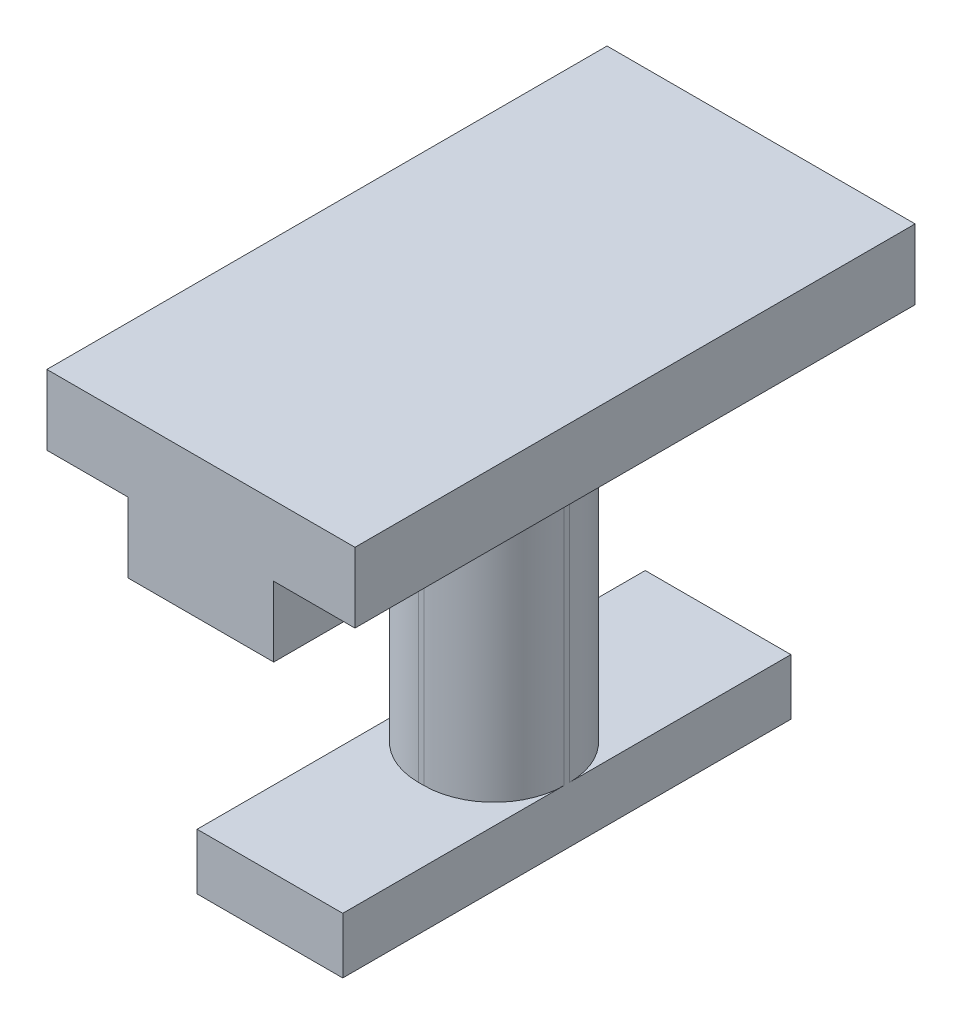
ISO-10303-21;
HEADER;
FILE_DESCRIPTION(('STEP AP214'),'2;1');
FILE_NAME('part.step','',(''),(''),'','','');
FILE_SCHEMA(('AUTOMOTIVE_DESIGN { 1 0 10303 214 1 1 1 1 }'));
ENDSEC;
DATA;
#1=APPLICATION_CONTEXT('core data for automotive mechanical design processes');
#2=APPLICATION_PROTOCOL_DEFINITION('international standard','automotive_design',2000,#1);
#3=PRODUCT_CONTEXT('',#1,'mechanical');
#4=PRODUCT('Part','Part','',(#3));
#5=PRODUCT_RELATED_PRODUCT_CATEGORY('part','',(#4));
#6=PRODUCT_DEFINITION_FORMATION('','',#4);
#7=PRODUCT_DEFINITION_CONTEXT('part definition',#1,'design');
#8=PRODUCT_DEFINITION('design','',#6,#7);
#9=PRODUCT_DEFINITION_SHAPE('','',#8);
#10=(LENGTH_UNIT() NAMED_UNIT(*) SI_UNIT(.MILLI.,.METRE.));
#11=(NAMED_UNIT(*) PLANE_ANGLE_UNIT() SI_UNIT($,.RADIAN.));
#12=(NAMED_UNIT(*) SI_UNIT($,.STERADIAN.) SOLID_ANGLE_UNIT());
#13=UNCERTAINTY_MEASURE_WITH_UNIT(LENGTH_MEASURE(1.E-05),#10,'distance_accuracy_value','');
#14=(GEOMETRIC_REPRESENTATION_CONTEXT(3) GLOBAL_UNCERTAINTY_ASSIGNED_CONTEXT((#13)) GLOBAL_UNIT_ASSIGNED_CONTEXT((#10,
#11,#12)) REPRESENTATION_CONTEXT('',''));
#15=CARTESIAN_POINT('',(0.,0.,0.));
#16=DIRECTION('',(0.,0.,1.));
#17=DIRECTION('',(1.,0.,0.));
#18=AXIS2_PLACEMENT_3D('',#15,#16,#17);
#19=CARTESIAN_POINT('',(2.6,-5.,20.));
#20=DIRECTION('',(0.,1.,0.));
#21=DIRECTION('',(-1.,0.,0.));
#22=AXIS2_PLACEMENT_3D('',#19,#20,#21);
#23=PLANE('',#22);
#24=DIRECTION('',(-1.,0.,0.));
#25=VECTOR('',#24,1.);
#26=CARTESIAN_POINT('',(-2.6,-5.,12.1359307784099));
#27=LINE('',#26,#25);
#28=CARTESIAN_POINT('',(0.0999999999999981,-5.,12.1359307784099));
#29=VERTEX_POINT('',#28);
#30=CARTESIAN_POINT('',(-0.0999999999999981,-5.,12.1359307784099));
#31=VERTEX_POINT('',#30);
#32=EDGE_CURVE('E216',#29,#31,#27,.T.);
#33=ORIENTED_EDGE('',*,*,#32,.F.);
#34=CARTESIAN_POINT('',(0.0999999999999981,-5.,9.63593077840994));
#35=DIRECTION('',(0.,1.,0.));
#36=DIRECTION('',(-1.,0.,0.));
#37=AXIS2_PLACEMENT_3D('',#34,#35,#36);
#38=CIRCLE('',#37,2.5);
#39=CARTESIAN_POINT('',(2.6,-5.,9.63593077840994));
#40=VERTEX_POINT('',#39);
#41=EDGE_CURVE('E359',#29,#40,#38,.T.);
#42=ORIENTED_EDGE('',*,*,#41,.T.);
#43=DIRECTION('',(0.,0.,-1.));
#44=VECTOR('',#43,1.);
#45=CARTESIAN_POINT('',(2.6,-5.,20.));
#46=LINE('',#45,#44);
#47=CARTESIAN_POINT('',(2.6,-5.,20.));
#48=VERTEX_POINT('',#47);
#49=EDGE_CURVE('E61',#48,#40,#46,.T.);
#50=ORIENTED_EDGE('',*,*,#49,.F.);
#51=DIRECTION('',(1.,0.,0.));
#52=VECTOR('',#51,1.);
#53=CARTESIAN_POINT('',(2.6,-5.,20.));
#54=LINE('',#53,#52);
#55=CARTESIAN_POINT('',(-2.6,-5.,20.));
#56=VERTEX_POINT('',#55);
#57=EDGE_CURVE('E251',#56,#48,#54,.T.);
#58=ORIENTED_EDGE('',*,*,#57,.F.);
#59=DIRECTION('',(0.,0.,-1.));
#60=VECTOR('',#59,1.);
#61=CARTESIAN_POINT('',(-2.6,-5.,20.));
#62=LINE('',#61,#60);
#63=CARTESIAN_POINT('',(-2.6,-5.,9.63593077840994));
#64=VERTEX_POINT('',#63);
#65=EDGE_CURVE('E297',#56,#64,#62,.T.);
#66=ORIENTED_EDGE('',*,*,#65,.T.);
#67=CARTESIAN_POINT('',(-0.0999999999999981,-5.,9.63593077840994));
#68=DIRECTION('',(0.,1.,0.));
#69=DIRECTION('',(-1.,0.,0.));
#70=AXIS2_PLACEMENT_3D('',#67,#68,#69);
#71=CIRCLE('',#70,2.5);
#72=EDGE_CURVE('E345',#64,#31,#71,.T.);
#73=ORIENTED_EDGE('',*,*,#72,.T.);
#74=EDGE_LOOP('',(#33,#42,#50,#58,#66,#73));
#75=FACE_BOUND('',#74,.T.);
#76=ADVANCED_FACE('F45',(#75),#23,.F.);
#77=DIRECTION('',(1.,0.,0.));
#78=VECTOR('',#77,1.);
#79=CARTESIAN_POINT('',(-2.6,-5.,6.93593077840994));
#80=LINE('',#79,#78);
#81=CARTESIAN_POINT('',(-0.0999999999999981,-5.,6.93593077840994));
#82=VERTEX_POINT('',#81);
#83=CARTESIAN_POINT('',(0.0999999999999981,-5.,6.93593077840994));
#84=VERTEX_POINT('',#83);
#85=EDGE_CURVE('E211',#82,#84,#80,.T.);
#86=ORIENTED_EDGE('',*,*,#85,.F.);
#87=CARTESIAN_POINT('',(-0.0999999999999981,-5.,9.43593077840995));
#88=DIRECTION('',(0.,1.,0.));
#89=DIRECTION('',(-1.,0.,0.));
#90=AXIS2_PLACEMENT_3D('',#87,#88,#89);
#91=CIRCLE('',#90,2.5);
#92=CARTESIAN_POINT('',(-2.6,-5.,9.43593077840995));
#93=VERTEX_POINT('',#92);
#94=EDGE_CURVE('E352',#82,#93,#91,.T.);
#95=ORIENTED_EDGE('',*,*,#94,.T.);
#96=CARTESIAN_POINT('',(-2.6,-5.,0.));
#97=VERTEX_POINT('',#96);
#98=EDGE_CURVE('E296',#93,#97,#62,.T.);
#99=ORIENTED_EDGE('',*,*,#98,.T.);
#100=DIRECTION('',(1.,0.,0.));
#101=VECTOR('',#100,1.);
#102=CARTESIAN_POINT('',(2.6,-5.,0.));
#103=LINE('',#102,#101);
#104=CARTESIAN_POINT('',(2.6,-5.,0.));
#105=VERTEX_POINT('',#104);
#106=EDGE_CURVE('E277',#97,#105,#103,.T.);
#107=ORIENTED_EDGE('',*,*,#106,.T.);
#108=CARTESIAN_POINT('',(2.6,-5.,9.43593077840995));
#109=VERTEX_POINT('',#108);
#110=EDGE_CURVE('E293',#109,#105,#46,.T.);
#111=ORIENTED_EDGE('',*,*,#110,.F.);
#112=CARTESIAN_POINT('',(0.0999999999999981,-5.,9.43593077840995));
#113=DIRECTION('',(0.,1.,0.));
#114=DIRECTION('',(-1.,0.,0.));
#115=AXIS2_PLACEMENT_3D('',#112,#113,#114);
#116=CIRCLE('',#115,2.5);
#117=EDGE_CURVE('E54',#109,#84,#116,.T.);
#118=ORIENTED_EDGE('',*,*,#117,.T.);
#119=EDGE_LOOP('',(#86,#95,#99,#107,#111,#118));
#120=FACE_BOUND('',#119,.T.);
#121=ADVANCED_FACE('F368',(#120),#23,.F.);
#122=CARTESIAN_POINT('',(5.5,0.,20.));
#123=DIRECTION('',(-1.,0.,0.));
#124=DIRECTION('',(0.,0.,1.));
#125=AXIS2_PLACEMENT_3D('',#122,#123,#124);
#126=PLANE('',#125);
#127=DIRECTION('',(0.,1.,0.));
#128=VECTOR('',#127,1.);
#129=CARTESIAN_POINT('',(5.5,0.,0.));
#130=LINE('',#129,#128);
#131=CARTESIAN_POINT('',(5.5,-2.5,0.));
#132=VERTEX_POINT('',#131);
#133=CARTESIAN_POINT('',(5.5,0.,0.));
#134=VERTEX_POINT('',#133);
#135=EDGE_CURVE('E229',#132,#134,#130,.T.);
#136=ORIENTED_EDGE('',*,*,#135,.T.);
#137=DIRECTION('',(0.,0.,-1.));
#138=VECTOR('',#137,1.);
#139=CARTESIAN_POINT('',(5.5,0.,20.));
#140=LINE('',#139,#138);
#141=CARTESIAN_POINT('',(5.5,0.,20.));
#142=VERTEX_POINT('',#141);
#143=EDGE_CURVE('E312',#142,#134,#140,.T.);
#144=ORIENTED_EDGE('',*,*,#143,.F.);
#145=DIRECTION('',(0.,1.,0.));
#146=VECTOR('',#145,1.);
#147=CARTESIAN_POINT('',(5.5,0.,20.));
#148=LINE('',#147,#146);
#149=CARTESIAN_POINT('',(5.5,-2.5,20.));
#150=VERTEX_POINT('',#149);
#151=EDGE_CURVE('E234',#150,#142,#148,.T.);
#152=ORIENTED_EDGE('',*,*,#151,.F.);
#153=DIRECTION('',(0.,0.,-1.));
#154=VECTOR('',#153,1.);
#155=CARTESIAN_POINT('',(5.5,-2.5,20.));
#156=LINE('',#155,#154);
#157=EDGE_CURVE('E260',#150,#132,#156,.T.);
#158=ORIENTED_EDGE('',*,*,#157,.T.);
#159=EDGE_LOOP('',(#136,#144,#152,#158));
#160=FACE_BOUND('',#159,.T.);
#161=ADVANCED_FACE('F465',(#160),#126,.F.);
#162=CARTESIAN_POINT('',(-5.5,0.,20.));
#163=DIRECTION('',(0.,-1.,0.));
#164=DIRECTION('',(1.,0.,0.));
#165=AXIS2_PLACEMENT_3D('',#162,#163,#164);
#166=PLANE('',#165);
#167=DIRECTION('',(-1.,0.,0.));
#168=VECTOR('',#167,1.);
#169=CARTESIAN_POINT('',(-5.5,0.,0.));
#170=LINE('',#169,#168);
#171=CARTESIAN_POINT('',(-5.5,0.,0.));
#172=VERTEX_POINT('',#171);
#173=EDGE_CURVE('E264',#134,#172,#170,.T.);
#174=ORIENTED_EDGE('',*,*,#173,.T.);
#175=DIRECTION('',(0.,0.,-1.));
#176=VECTOR('',#175,1.);
#177=CARTESIAN_POINT('',(-5.5,0.,20.));
#178=LINE('',#177,#176);
#179=CARTESIAN_POINT('',(-5.5,0.,20.));
#180=VERTEX_POINT('',#179);
#181=EDGE_CURVE('E308',#180,#172,#178,.T.);
#182=ORIENTED_EDGE('',*,*,#181,.F.);
#183=DIRECTION('',(-1.,0.,0.));
#184=VECTOR('',#183,1.);
#185=CARTESIAN_POINT('',(-5.5,0.,20.));
#186=LINE('',#185,#184);
#187=EDGE_CURVE('E238',#142,#180,#186,.T.);
#188=ORIENTED_EDGE('',*,*,#187,.F.);
#189=ORIENTED_EDGE('',*,*,#143,.T.);
#190=EDGE_LOOP('',(#174,#182,#188,#189));
#191=FACE_BOUND('',#190,.T.);
#192=ADVANCED_FACE('F478',(#191),#166,.F.);
#193=CARTESIAN_POINT('',(-5.5,0.,20.));
#194=DIRECTION('',(1.,0.,0.));
#195=DIRECTION('',(0.,0.,-1.));
#196=AXIS2_PLACEMENT_3D('',#193,#194,#195);
#197=PLANE('',#196);
#198=DIRECTION('',(0.,-1.,0.));
#199=VECTOR('',#198,1.);
#200=CARTESIAN_POINT('',(-5.5,0.,0.));
#201=LINE('',#200,#199);
#202=CARTESIAN_POINT('',(-5.5,-2.5,0.));
#203=VERTEX_POINT('',#202);
#204=EDGE_CURVE('E267',#172,#203,#201,.T.);
#205=ORIENTED_EDGE('',*,*,#204,.T.);
#206=DIRECTION('',(0.,0.,-1.));
#207=VECTOR('',#206,1.);
#208=CARTESIAN_POINT('',(-5.5,-2.5,20.));
#209=LINE('',#208,#207);
#210=CARTESIAN_POINT('',(-5.5,-2.5,20.));
#211=VERTEX_POINT('',#210);
#212=EDGE_CURVE('E304',#211,#203,#209,.T.);
#213=ORIENTED_EDGE('',*,*,#212,.F.);
#214=DIRECTION('',(0.,-1.,0.));
#215=VECTOR('',#214,1.);
#216=CARTESIAN_POINT('',(-5.5,0.,20.));
#217=LINE('',#216,#215);
#218=EDGE_CURVE('E242',#180,#211,#217,.T.);
#219=ORIENTED_EDGE('',*,*,#218,.F.);
#220=ORIENTED_EDGE('',*,*,#181,.T.);
#221=EDGE_LOOP('',(#205,#213,#219,#220));
#222=FACE_BOUND('',#221,.T.);
#223=ADVANCED_FACE('F474',(#222),#197,.F.);
#224=CARTESIAN_POINT('',(-5.5,-2.5,20.));
#225=DIRECTION('',(0.,1.,0.));
#226=DIRECTION('',(-1.,0.,0.));
#227=AXIS2_PLACEMENT_3D('',#224,#225,#226);
#228=PLANE('',#227);
#229=DIRECTION('',(1.,0.,0.));
#230=VECTOR('',#229,1.);
#231=CARTESIAN_POINT('',(-5.5,-2.5,0.));
#232=LINE('',#231,#230);
#233=CARTESIAN_POINT('',(-2.6,-2.5,0.));
#234=VERTEX_POINT('',#233);
#235=EDGE_CURVE('E270',#203,#234,#232,.T.);
#236=ORIENTED_EDGE('',*,*,#235,.T.);
#237=DIRECTION('',(0.,0.,-1.));
#238=VECTOR('',#237,1.);
#239=CARTESIAN_POINT('',(-2.6,-2.5,20.));
#240=LINE('',#239,#238);
#241=CARTESIAN_POINT('',(-2.6,-2.5,20.));
#242=VERTEX_POINT('',#241);
#243=EDGE_CURVE('E300',#242,#234,#240,.T.);
#244=ORIENTED_EDGE('',*,*,#243,.F.);
#245=DIRECTION('',(1.,0.,0.));
#246=VECTOR('',#245,1.);
#247=CARTESIAN_POINT('',(-5.5,-2.5,20.));
#248=LINE('',#247,#246);
#249=EDGE_CURVE('E245',#211,#242,#248,.T.);
#250=ORIENTED_EDGE('',*,*,#249,.F.);
#251=ORIENTED_EDGE('',*,*,#212,.T.);
#252=EDGE_LOOP('',(#236,#244,#250,#251));
#253=FACE_BOUND('',#252,.T.);
#254=ADVANCED_FACE('F471',(#253),#228,.F.);
#255=CARTESIAN_POINT('',(-2.6,-2.5,20.));
#256=DIRECTION('',(1.,0.,0.));
#257=DIRECTION('',(0.,0.,-1.));
#258=AXIS2_PLACEMENT_3D('',#255,#256,#257);
#259=PLANE('',#258);
#260=DIRECTION('',(0.,1.,0.));
#261=VECTOR('',#260,1.);
#262=CARTESIAN_POINT('',(-2.6,-2.5,9.63593077840994));
#263=LINE('',#262,#261);
#264=CARTESIAN_POINT('',(-2.6,-14.,9.63593077840994));
#265=VERTEX_POINT('',#264);
#266=EDGE_CURVE('E320',#265,#64,#263,.T.);
#267=ORIENTED_EDGE('',*,*,#266,.T.);
#268=ORIENTED_EDGE('',*,*,#65,.F.);
#269=DIRECTION('',(0.,-1.,0.));
#270=VECTOR('',#269,1.);
#271=CARTESIAN_POINT('',(-2.6,-2.5,20.));
#272=LINE('',#271,#270);
#273=EDGE_CURVE('E248',#242,#56,#272,.T.);
#274=ORIENTED_EDGE('',*,*,#273,.F.);
#275=ORIENTED_EDGE('',*,*,#243,.T.);
#276=DIRECTION('',(0.,-1.,0.));
#277=VECTOR('',#276,1.);
#278=CARTESIAN_POINT('',(-2.6,-2.5,0.));
#279=LINE('',#278,#277);
#280=EDGE_CURVE('E273',#234,#97,#279,.T.);
#281=ORIENTED_EDGE('',*,*,#280,.T.);
#282=ORIENTED_EDGE('',*,*,#98,.F.);
#283=DIRECTION('',(0.,1.,0.));
#284=VECTOR('',#283,1.);
#285=CARTESIAN_POINT('',(-2.6,-2.5,9.43593077840995));
#286=LINE('',#285,#284);
#287=CARTESIAN_POINT('',(-2.6,-14.,9.43593077840995));
#288=VERTEX_POINT('',#287);
#289=EDGE_CURVE('E316',#93,#288,#286,.F.);
#290=ORIENTED_EDGE('',*,*,#289,.T.);
#291=DIRECTION('',(0.,0.,-1.));
#292=VECTOR('',#291,1.);
#293=CARTESIAN_POINT('',(-2.6,-14.,17.5359307784099));
#294=LINE('',#293,#292);
#295=CARTESIAN_POINT('',(-2.6,-14.,1.53593077840994));
#296=VERTEX_POINT('',#295);
#297=EDGE_CURVE('E425',#288,#296,#294,.T.);
#298=ORIENTED_EDGE('',*,*,#297,.T.);
#299=DIRECTION('',(0.,1.,0.));
#300=VECTOR('',#299,1.);
#301=CARTESIAN_POINT('',(-2.6,-16.,1.53593077840994));
#302=LINE('',#301,#300);
#303=CARTESIAN_POINT('',(-2.6,-16.,1.53593077840994));
#304=VERTEX_POINT('',#303);
#305=EDGE_CURVE('E433',#304,#296,#302,.T.);
#306=ORIENTED_EDGE('',*,*,#305,.F.);
#307=DIRECTION('',(0.,0.,-1.));
#308=VECTOR('',#307,1.);
#309=CARTESIAN_POINT('',(-2.6,-16.,17.5359307784099));
#310=LINE('',#309,#308);
#311=CARTESIAN_POINT('',(-2.6,-16.,17.5359307784099));
#312=VERTEX_POINT('',#311);
#313=EDGE_CURVE('E200',#312,#304,#310,.T.);
#314=ORIENTED_EDGE('',*,*,#313,.F.);
#315=DIRECTION('',(0.,1.,0.));
#316=VECTOR('',#315,1.);
#317=CARTESIAN_POINT('',(-2.6,-16.,17.5359307784099));
#318=LINE('',#317,#316);
#319=CARTESIAN_POINT('',(-2.6,-14.,17.5359307784099));
#320=VERTEX_POINT('',#319);
#321=EDGE_CURVE('E218',#312,#320,#318,.T.);
#322=ORIENTED_EDGE('',*,*,#321,.T.);
#323=EDGE_CURVE('E205',#320,#265,#294,.T.);
#324=ORIENTED_EDGE('',*,*,#323,.T.);
#325=EDGE_LOOP('',(#267,#268,#274,#275,#281,#282,#290,#298,#306,#314,#322,#324));
#326=FACE_BOUND('',#325,.T.);
#327=ADVANCED_FACE('F389',(#326),#259,.F.);
#328=CARTESIAN_POINT('',(2.6,-2.5,20.));
#329=DIRECTION('',(-1.,0.,0.));
#330=DIRECTION('',(0.,0.,1.));
#331=AXIS2_PLACEMENT_3D('',#328,#329,#330);
#332=PLANE('',#331);
#333=ORIENTED_EDGE('',*,*,#49,.T.);
#334=DIRECTION('',(0.,1.,0.));
#335=VECTOR('',#334,1.);
#336=CARTESIAN_POINT('',(2.6,-2.5,9.63593077840994));
#337=LINE('',#336,#335);
#338=CARTESIAN_POINT('',(2.6,-14.,9.63593077840994));
#339=VERTEX_POINT('',#338);
#340=EDGE_CURVE('E342',#40,#339,#337,.F.);
#341=ORIENTED_EDGE('',*,*,#340,.T.);
#342=DIRECTION('',(0.,0.,1.));
#343=VECTOR('',#342,1.);
#344=CARTESIAN_POINT('',(2.6,-14.,1.53593077840994));
#345=LINE('',#344,#343);
#346=CARTESIAN_POINT('',(2.6,-14.,17.5359307784099));
#347=VERTEX_POINT('',#346);
#348=EDGE_CURVE('E69',#339,#347,#345,.T.);
#349=ORIENTED_EDGE('',*,*,#348,.T.);
#350=DIRECTION('',(0.,1.,0.));
#351=VECTOR('',#350,1.);
#352=CARTESIAN_POINT('',(2.6,-16.,17.5359307784099));
#353=LINE('',#352,#351);
#354=CARTESIAN_POINT('',(2.6,-16.,17.5359307784099));
#355=VERTEX_POINT('',#354);
#356=EDGE_CURVE('E190',#355,#347,#353,.T.);
#357=ORIENTED_EDGE('',*,*,#356,.F.);
#358=DIRECTION('',(0.,0.,1.));
#359=VECTOR('',#358,1.);
#360=CARTESIAN_POINT('',(2.6,-16.,1.53593077840994));
#361=LINE('',#360,#359);
#362=CARTESIAN_POINT('',(2.6,-16.,1.53593077840994));
#363=VERTEX_POINT('',#362);
#364=EDGE_CURVE('E183',#363,#355,#361,.T.);
#365=ORIENTED_EDGE('',*,*,#364,.F.);
#366=DIRECTION('',(0.,1.,0.));
#367=VECTOR('',#366,1.);
#368=CARTESIAN_POINT('',(2.6,-16.,1.53593077840994));
#369=LINE('',#368,#367);
#370=CARTESIAN_POINT('',(2.6,-14.,1.53593077840994));
#371=VERTEX_POINT('',#370);
#372=EDGE_CURVE('E187',#363,#371,#369,.T.);
#373=ORIENTED_EDGE('',*,*,#372,.T.);
#374=CARTESIAN_POINT('',(2.6,-14.,9.43593077840995));
#375=VERTEX_POINT('',#374);
#376=EDGE_CURVE('E379',#371,#375,#345,.T.);
#377=ORIENTED_EDGE('',*,*,#376,.T.);
#378=DIRECTION('',(0.,1.,0.));
#379=VECTOR('',#378,1.);
#380=CARTESIAN_POINT('',(2.6,-2.5,9.43593077840995));
#381=LINE('',#380,#379);
#382=EDGE_CURVE('E338',#375,#109,#381,.T.);
#383=ORIENTED_EDGE('',*,*,#382,.T.);
#384=ORIENTED_EDGE('',*,*,#110,.T.);
#385=DIRECTION('',(0.,1.,0.));
#386=VECTOR('',#385,1.);
#387=CARTESIAN_POINT('',(2.6,-2.5,0.));
#388=LINE('',#387,#386);
#389=CARTESIAN_POINT('',(2.6,-2.5,0.));
#390=VERTEX_POINT('',#389);
#391=EDGE_CURVE('E281',#105,#390,#388,.T.);
#392=ORIENTED_EDGE('',*,*,#391,.T.);
#393=DIRECTION('',(0.,0.,-1.));
#394=VECTOR('',#393,1.);
#395=CARTESIAN_POINT('',(2.6,-2.5,20.));
#396=LINE('',#395,#394);
#397=CARTESIAN_POINT('',(2.6,-2.5,20.));
#398=VERTEX_POINT('',#397);
#399=EDGE_CURVE('E289',#398,#390,#396,.T.);
#400=ORIENTED_EDGE('',*,*,#399,.F.);
#401=DIRECTION('',(0.,1.,0.));
#402=VECTOR('',#401,1.);
#403=CARTESIAN_POINT('',(2.6,-2.5,20.));
#404=LINE('',#403,#402);
#405=EDGE_CURVE('E254',#48,#398,#404,.T.);
#406=ORIENTED_EDGE('',*,*,#405,.F.);
#407=EDGE_LOOP('',(#333,#341,#349,#357,#365,#373,#377,#383,#384,#392,#400,#406));
#408=FACE_BOUND('',#407,.T.);
#409=ADVANCED_FACE('F185',(#408),#332,.F.);
#410=CARTESIAN_POINT('',(5.5,-2.5,20.));
#411=DIRECTION('',(0.,1.,0.));
#412=DIRECTION('',(-1.,0.,0.));
#413=AXIS2_PLACEMENT_3D('',#410,#411,#412);
#414=PLANE('',#413);
#415=DIRECTION('',(1.,0.,0.));
#416=VECTOR('',#415,1.);
#417=CARTESIAN_POINT('',(5.5,-2.5,0.));
#418=LINE('',#417,#416);
#419=EDGE_CURVE('E239',#390,#132,#418,.T.);
#420=ORIENTED_EDGE('',*,*,#419,.T.);
#421=ORIENTED_EDGE('',*,*,#157,.F.);
#422=DIRECTION('',(1.,0.,0.));
#423=VECTOR('',#422,1.);
#424=CARTESIAN_POINT('',(5.5,-2.5,20.));
#425=LINE('',#424,#423);
#426=EDGE_CURVE('E257',#398,#150,#425,.T.);
#427=ORIENTED_EDGE('',*,*,#426,.F.);
#428=ORIENTED_EDGE('',*,*,#399,.T.);
#429=EDGE_LOOP('',(#420,#421,#427,#428));
#430=FACE_BOUND('',#429,.T.);
#431=ADVANCED_FACE('F400',(#430),#414,.F.);
#432=CARTESIAN_POINT('',(0.,0.,20.));
#433=DIRECTION('',(0.,0.,-1.));
#434=DIRECTION('',(-1.,0.,0.));
#435=AXIS2_PLACEMENT_3D('',#432,#433,#434);
#436=PLANE('',#435);
#437=ORIENTED_EDGE('',*,*,#151,.T.);
#438=ORIENTED_EDGE('',*,*,#187,.T.);
#439=ORIENTED_EDGE('',*,*,#218,.T.);
#440=ORIENTED_EDGE('',*,*,#249,.T.);
#441=ORIENTED_EDGE('',*,*,#273,.T.);
#442=ORIENTED_EDGE('',*,*,#57,.T.);
#443=ORIENTED_EDGE('',*,*,#405,.T.);
#444=ORIENTED_EDGE('',*,*,#426,.T.);
#445=EDGE_LOOP('',(#437,#438,#439,#440,#441,#442,#443,#444));
#446=FACE_BOUND('',#445,.T.);
#447=ADVANCED_FACE('F404',(#446),#436,.F.);
#448=CARTESIAN_POINT('',(0.,0.,0.));
#449=DIRECTION('',(0.,0.,-1.));
#450=DIRECTION('',(-1.,0.,0.));
#451=AXIS2_PLACEMENT_3D('',#448,#449,#450);
#452=PLANE('',#451);
#453=ORIENTED_EDGE('',*,*,#135,.F.);
#454=ORIENTED_EDGE('',*,*,#419,.F.);
#455=ORIENTED_EDGE('',*,*,#391,.F.);
#456=ORIENTED_EDGE('',*,*,#106,.F.);
#457=ORIENTED_EDGE('',*,*,#280,.F.);
#458=ORIENTED_EDGE('',*,*,#235,.F.);
#459=ORIENTED_EDGE('',*,*,#204,.F.);
#460=ORIENTED_EDGE('',*,*,#173,.F.);
#461=EDGE_LOOP('',(#453,#454,#455,#456,#457,#458,#459,#460));
#462=FACE_BOUND('',#461,.T.);
#463=ADVANCED_FACE('F395',(#462),#452,.T.);
#464=CARTESIAN_POINT('',(-2.6,-14.,6.93593077840994));
#465=DIRECTION('',(0.,0.,1.));
#466=DIRECTION('',(1.,0.,0.));
#467=AXIS2_PLACEMENT_3D('',#464,#465,#466);
#468=PLANE('',#467);
#469=DIRECTION('',(1.,0.,0.));
#470=VECTOR('',#469,1.);
#471=CARTESIAN_POINT('',(-2.6,-14.,6.93593077840994));
#472=LINE('',#471,#470);
#473=CARTESIAN_POINT('',(-0.0999999999999981,-14.,6.93593077840994));
#474=VERTEX_POINT('',#473);
#475=CARTESIAN_POINT('',(0.0999999999999981,-14.,6.93593077840994));
#476=VERTEX_POINT('',#475);
#477=EDGE_CURVE('E222',#474,#476,#472,.T.);
#478=ORIENTED_EDGE('',*,*,#477,.F.);
#479=DIRECTION('',(0.,1.,0.));
#480=VECTOR('',#479,1.);
#481=CARTESIAN_POINT('',(-0.0999999999999981,-14.,6.93593077840994));
#482=LINE('',#481,#480);
#483=EDGE_CURVE('E334',#474,#82,#482,.T.);
#484=ORIENTED_EDGE('',*,*,#483,.T.);
#485=ORIENTED_EDGE('',*,*,#85,.T.);
#486=DIRECTION('',(0.,1.,0.));
#487=VECTOR('',#486,1.);
#488=CARTESIAN_POINT('',(0.0999999999999981,-14.,6.93593077840994));
#489=LINE('',#488,#487);
#490=EDGE_CURVE('E331',#84,#476,#489,.F.);
#491=ORIENTED_EDGE('',*,*,#490,.T.);
#492=EDGE_LOOP('',(#478,#484,#485,#491));
#493=FACE_BOUND('',#492,.T.);
#494=ADVANCED_FACE('F374',(#493),#468,.F.);
#495=CARTESIAN_POINT('',(-2.6,-14.,12.1359307784099));
#496=DIRECTION('',(0.,0.,-1.));
#497=DIRECTION('',(-1.,0.,0.));
#498=AXIS2_PLACEMENT_3D('',#495,#496,#497);
#499=PLANE('',#498);
#500=ORIENTED_EDGE('',*,*,#32,.T.);
#501=DIRECTION('',(0.,1.,0.));
#502=VECTOR('',#501,1.);
#503=CARTESIAN_POINT('',(-0.0999999999999981,-14.,12.1359307784099));
#504=LINE('',#503,#502);
#505=CARTESIAN_POINT('',(-0.0999999999999981,-14.,12.1359307784099));
#506=VERTEX_POINT('',#505);
#507=EDGE_CURVE('E328',#31,#506,#504,.F.);
#508=ORIENTED_EDGE('',*,*,#507,.T.);
#509=DIRECTION('',(-1.,0.,0.));
#510=VECTOR('',#509,1.);
#511=CARTESIAN_POINT('',(-2.6,-14.,12.1359307784099));
#512=LINE('',#511,#510);
#513=CARTESIAN_POINT('',(0.0999999999999981,-14.,12.1359307784099));
#514=VERTEX_POINT('',#513);
#515=EDGE_CURVE('E226',#514,#506,#512,.T.);
#516=ORIENTED_EDGE('',*,*,#515,.F.);
#517=DIRECTION('',(0.,1.,0.));
#518=VECTOR('',#517,1.);
#519=CARTESIAN_POINT('',(0.0999999999999981,-14.,12.1359307784099));
#520=LINE('',#519,#518);
#521=EDGE_CURVE('E324',#514,#29,#520,.T.);
#522=ORIENTED_EDGE('',*,*,#521,.T.);
#523=EDGE_LOOP('',(#500,#508,#516,#522));
#524=FACE_BOUND('',#523,.T.);
#525=ADVANCED_FACE('F449',(#524),#499,.F.);
#526=CARTESIAN_POINT('',(0.,-14.,0.));
#527=DIRECTION('',(0.,-1.,0.));
#528=DIRECTION('',(0.,0.,-1.));
#529=AXIS2_PLACEMENT_3D('',#526,#527,#528);
#530=PLANE('',#529);
#531=ORIENTED_EDGE('',*,*,#297,.F.);
#532=CARTESIAN_POINT('',(-0.0999999999999981,-14.,9.43593077840995));
#533=DIRECTION('',(0.,-1.,0.));
#534=DIRECTION('',(0.,0.,-1.));
#535=AXIS2_PLACEMENT_3D('',#532,#533,#534);
#536=CIRCLE('',#535,2.5);
#537=EDGE_CURVE('E356',#288,#474,#536,.T.);
#538=ORIENTED_EDGE('',*,*,#537,.T.);
#539=ORIENTED_EDGE('',*,*,#477,.T.);
#540=CARTESIAN_POINT('',(0.0999999999999981,-14.,9.43593077840995));
#541=DIRECTION('',(0.,-1.,0.));
#542=DIRECTION('',(0.,0.,-1.));
#543=AXIS2_PLACEMENT_3D('',#540,#541,#542);
#544=CIRCLE('',#543,2.5);
#545=EDGE_CURVE('E11',#476,#375,#544,.T.);
#546=ORIENTED_EDGE('',*,*,#545,.T.);
#547=ORIENTED_EDGE('',*,*,#376,.F.);
#548=DIRECTION('',(1.,0.,0.));
#549=VECTOR('',#548,1.);
#550=CARTESIAN_POINT('',(-2.6,-14.,1.53593077840994));
#551=LINE('',#550,#549);
#552=EDGE_CURVE('E209',#296,#371,#551,.T.);
#553=ORIENTED_EDGE('',*,*,#552,.F.);
#554=EDGE_LOOP('',(#531,#538,#539,#546,#547,#553));
#555=FACE_BOUND('',#554,.T.);
#556=ADVANCED_FACE('F378',(#555),#530,.F.);
#557=ORIENTED_EDGE('',*,*,#348,.F.);
#558=CARTESIAN_POINT('',(0.0999999999999981,-14.,9.63593077840994));
#559=DIRECTION('',(0.,-1.,0.));
#560=DIRECTION('',(0.,0.,-1.));
#561=AXIS2_PLACEMENT_3D('',#558,#559,#560);
#562=CIRCLE('',#561,2.5);
#563=EDGE_CURVE('E362',#339,#514,#562,.T.);
#564=ORIENTED_EDGE('',*,*,#563,.T.);
#565=ORIENTED_EDGE('',*,*,#515,.T.);
#566=CARTESIAN_POINT('',(-0.0999999999999981,-14.,9.63593077840994));
#567=DIRECTION('',(0.,-1.,0.));
#568=DIRECTION('',(0.,0.,-1.));
#569=AXIS2_PLACEMENT_3D('',#566,#567,#568);
#570=CIRCLE('',#569,2.5);
#571=EDGE_CURVE('E348',#506,#265,#570,.T.);
#572=ORIENTED_EDGE('',*,*,#571,.T.);
#573=ORIENTED_EDGE('',*,*,#323,.F.);
#574=DIRECTION('',(-1.,0.,0.));
#575=VECTOR('',#574,1.);
#576=CARTESIAN_POINT('',(2.6,-14.,17.5359307784099));
#577=LINE('',#576,#575);
#578=EDGE_CURVE('E420',#347,#320,#577,.T.);
#579=ORIENTED_EDGE('',*,*,#578,.F.);
#580=EDGE_LOOP('',(#557,#564,#565,#572,#573,#579));
#581=FACE_BOUND('',#580,.T.);
#582=ADVANCED_FACE('F423',(#581),#530,.F.);
#583=CARTESIAN_POINT('',(-2.6,-16.,1.53593077840994));
#584=DIRECTION('',(0.,0.,1.));
#585=DIRECTION('',(1.,0.,0.));
#586=AXIS2_PLACEMENT_3D('',#583,#584,#585);
#587=PLANE('',#586);
#588=ORIENTED_EDGE('',*,*,#552,.T.);
#589=ORIENTED_EDGE('',*,*,#372,.F.);
#590=DIRECTION('',(1.,0.,0.));
#591=VECTOR('',#590,1.);
#592=CARTESIAN_POINT('',(-2.6,-16.,1.53593077840994));
#593=LINE('',#592,#591);
#594=EDGE_CURVE('E195',#304,#363,#593,.T.);
#595=ORIENTED_EDGE('',*,*,#594,.F.);
#596=ORIENTED_EDGE('',*,*,#305,.T.);
#597=EDGE_LOOP('',(#588,#589,#595,#596));
#598=FACE_BOUND('',#597,.T.);
#599=ADVANCED_FACE('F207',(#598),#587,.F.);
#600=CARTESIAN_POINT('',(2.6,-16.,17.5359307784099));
#601=DIRECTION('',(0.,0.,-1.));
#602=DIRECTION('',(-1.,0.,0.));
#603=AXIS2_PLACEMENT_3D('',#600,#601,#602);
#604=PLANE('',#603);
#605=ORIENTED_EDGE('',*,*,#578,.T.);
#606=ORIENTED_EDGE('',*,*,#321,.F.);
#607=DIRECTION('',(-1.,0.,0.));
#608=VECTOR('',#607,1.);
#609=CARTESIAN_POINT('',(2.6,-16.,17.5359307784099));
#610=LINE('',#609,#608);
#611=EDGE_CURVE('E194',#355,#312,#610,.T.);
#612=ORIENTED_EDGE('',*,*,#611,.F.);
#613=ORIENTED_EDGE('',*,*,#356,.T.);
#614=EDGE_LOOP('',(#605,#606,#612,#613));
#615=FACE_BOUND('',#614,.T.);
#616=ADVANCED_FACE('F418',(#615),#604,.F.);
#617=CARTESIAN_POINT('',(0.,-16.,0.));
#618=DIRECTION('',(0.,-1.,0.));
#619=DIRECTION('',(0.,0.,-1.));
#620=AXIS2_PLACEMENT_3D('',#617,#618,#619);
#621=PLANE('',#620);
#622=ORIENTED_EDGE('',*,*,#594,.T.);
#623=ORIENTED_EDGE('',*,*,#364,.T.);
#624=ORIENTED_EDGE('',*,*,#611,.T.);
#625=ORIENTED_EDGE('',*,*,#313,.T.);
#626=EDGE_LOOP('',(#622,#623,#624,#625));
#627=FACE_BOUND('',#626,.T.);
#628=ADVANCED_FACE('F198',(#627),#621,.T.);
#629=CARTESIAN_POINT('',(-0.0999999999999981,-2.5,9.63593077840994));
#630=DIRECTION('',(0.,1.,0.));
#631=DIRECTION('',(0.,0.,1.));
#632=AXIS2_PLACEMENT_3D('',#629,#630,#631);
#633=CYLINDRICAL_SURFACE('',#632,2.5);
#634=ORIENTED_EDGE('',*,*,#571,.F.);
#635=ORIENTED_EDGE('',*,*,#507,.F.);
#636=ORIENTED_EDGE('',*,*,#72,.F.);
#637=ORIENTED_EDGE('',*,*,#266,.F.);
#638=EDGE_LOOP('',(#634,#635,#636,#637));
#639=FACE_BOUND('',#638,.T.);
#640=ADVANCED_FACE('F447',(#639),#633,.T.);
#641=CARTESIAN_POINT('',(-0.0999999999999981,-14.,9.43593077840995));
#642=DIRECTION('',(0.,1.,0.));
#643=DIRECTION('',(0.,0.,1.));
#644=AXIS2_PLACEMENT_3D('',#641,#642,#643);
#645=CYLINDRICAL_SURFACE('',#644,2.5);
#646=ORIENTED_EDGE('',*,*,#537,.F.);
#647=ORIENTED_EDGE('',*,*,#289,.F.);
#648=ORIENTED_EDGE('',*,*,#94,.F.);
#649=ORIENTED_EDGE('',*,*,#483,.F.);
#650=EDGE_LOOP('',(#646,#647,#648,#649));
#651=FACE_BOUND('',#650,.T.);
#652=ADVANCED_FACE('F382',(#651),#645,.T.);
#653=CARTESIAN_POINT('',(0.0999999999999981,-14.,9.63593077840994));
#654=DIRECTION('',(0.,1.,0.));
#655=DIRECTION('',(0.,0.,1.));
#656=AXIS2_PLACEMENT_3D('',#653,#654,#655);
#657=CYLINDRICAL_SURFACE('',#656,2.5);
#658=ORIENTED_EDGE('',*,*,#563,.F.);
#659=ORIENTED_EDGE('',*,*,#340,.F.);
#660=ORIENTED_EDGE('',*,*,#41,.F.);
#661=ORIENTED_EDGE('',*,*,#521,.F.);
#662=EDGE_LOOP('',(#658,#659,#660,#661));
#663=FACE_BOUND('',#662,.T.);
#664=ADVANCED_FACE('F414',(#663),#657,.T.);
#665=CARTESIAN_POINT('',(0.0999999999999981,-2.5,9.43593077840995));
#666=DIRECTION('',(0.,1.,0.));
#667=DIRECTION('',(0.,0.,1.));
#668=AXIS2_PLACEMENT_3D('',#665,#666,#667);
#669=CYLINDRICAL_SURFACE('',#668,2.5);
#670=ORIENTED_EDGE('',*,*,#545,.F.);
#671=ORIENTED_EDGE('',*,*,#490,.F.);
#672=ORIENTED_EDGE('',*,*,#117,.F.);
#673=ORIENTED_EDGE('',*,*,#382,.F.);
#674=EDGE_LOOP('',(#670,#671,#672,#673));
#675=FACE_BOUND('',#674,.T.);
#676=ADVANCED_FACE('F47',(#675),#669,.T.);
#677=CLOSED_SHELL('',(#76,#121,#161,#192,#223,#254,#327,#409,#431,#447,#463,#494,#525,#556,#582,
#599,#616,#628,#640,#652,#664,#676));
#678=MANIFOLD_SOLID_BREP('B2',#677);
#679=ADVANCED_BREP_SHAPE_REPRESENTATION('',(#18,#678),#14);
#680=SHAPE_DEFINITION_REPRESENTATION(#9,#679);
ENDSEC;
END-ISO-10303-21;
